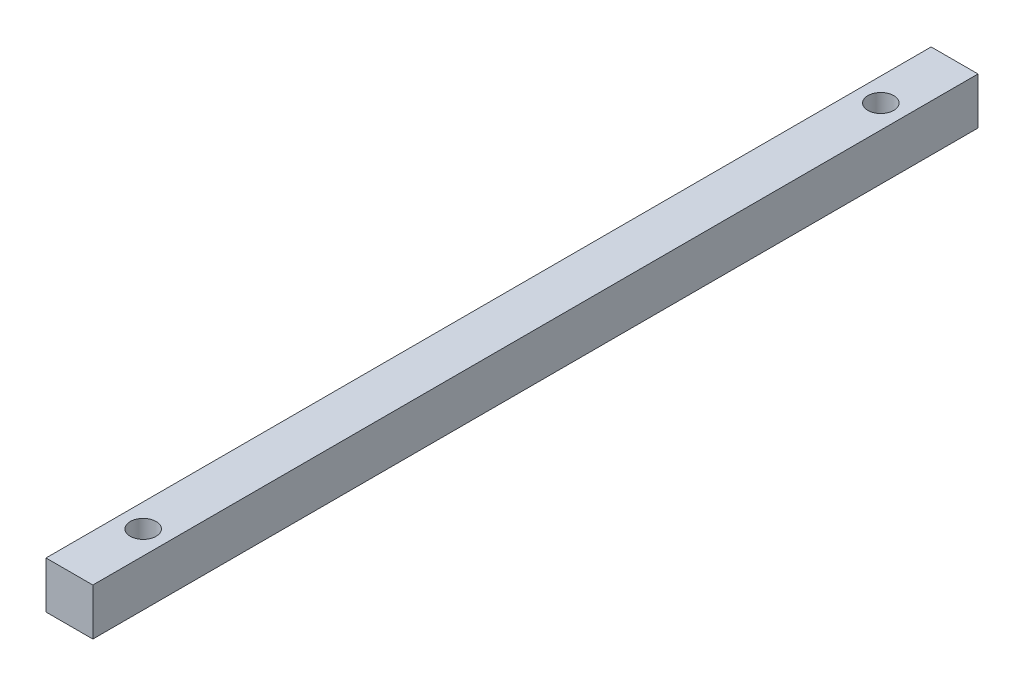
ISO-10303-21;
HEADER;
FILE_DESCRIPTION(('STEP AP214'),'2;1');
FILE_NAME('part.step','',(''),(''),'','','');
FILE_SCHEMA(('AUTOMOTIVE_DESIGN { 1 0 10303 214 1 1 1 1 }'));
ENDSEC;
DATA;
#1=APPLICATION_CONTEXT('core data for automotive mechanical design processes');
#2=APPLICATION_PROTOCOL_DEFINITION('international standard','automotive_design',2000,#1);
#3=PRODUCT_CONTEXT('',#1,'mechanical');
#4=PRODUCT('Part','Part','',(#3));
#5=PRODUCT_RELATED_PRODUCT_CATEGORY('part','',(#4));
#6=PRODUCT_DEFINITION_FORMATION('','',#4);
#7=PRODUCT_DEFINITION_CONTEXT('part definition',#1,'design');
#8=PRODUCT_DEFINITION('design','',#6,#7);
#9=PRODUCT_DEFINITION_SHAPE('','',#8);
#10=(LENGTH_UNIT() NAMED_UNIT(*) SI_UNIT(.MILLI.,.METRE.));
#11=(NAMED_UNIT(*) PLANE_ANGLE_UNIT() SI_UNIT($,.RADIAN.));
#12=(NAMED_UNIT(*) SI_UNIT($,.STERADIAN.) SOLID_ANGLE_UNIT());
#13=UNCERTAINTY_MEASURE_WITH_UNIT(LENGTH_MEASURE(1.E-05),#10,'distance_accuracy_value','');
#14=(GEOMETRIC_REPRESENTATION_CONTEXT(3) GLOBAL_UNCERTAINTY_ASSIGNED_CONTEXT((#13)) GLOBAL_UNIT_ASSIGNED_CONTEXT((#10,
#11,#12)) REPRESENTATION_CONTEXT('',''));
#15=CARTESIAN_POINT('',(0.,0.,0.));
#16=DIRECTION('',(0.,0.,1.));
#17=DIRECTION('',(1.,0.,0.));
#18=AXIS2_PLACEMENT_3D('',#15,#16,#17);
#19=CARTESIAN_POINT('',(3.175,-3.175,609.6));
#20=DIRECTION('',(-1.,0.,0.));
#21=DIRECTION('',(0.,0.,1.));
#22=AXIS2_PLACEMENT_3D('',#19,#20,#21);
#23=PLANE('',#22);
#24=DIRECTION('',(0.,0.,-1.));
#25=VECTOR('',#24,1.);
#26=CARTESIAN_POINT('',(3.175,3.175,609.6));
#27=LINE('',#26,#25);
#28=CARTESIAN_POINT('',(3.175,3.175,-489.6));
#29=VERTEX_POINT('',#28);
#30=CARTESIAN_POINT('',(3.175,3.175,-609.6));
#31=VERTEX_POINT('',#30);
#32=EDGE_CURVE('E47',#29,#31,#27,.T.);
#33=ORIENTED_EDGE('',*,*,#32,.F.);
#34=DIRECTION('',(0.,-1.,0.));
#35=VECTOR('',#34,1.);
#36=CARTESIAN_POINT('',(3.175,-3.175,-489.6));
#37=LINE('',#36,#35);
#38=CARTESIAN_POINT('',(3.175,-3.175,-489.6));
#39=VERTEX_POINT('',#38);
#40=EDGE_CURVE('E79',#29,#39,#37,.T.);
#41=ORIENTED_EDGE('',*,*,#40,.T.);
#42=DIRECTION('',(0.,0.,-1.));
#43=VECTOR('',#42,1.);
#44=CARTESIAN_POINT('',(3.175,-3.175,609.6));
#45=LINE('',#44,#43);
#46=CARTESIAN_POINT('',(3.175,-3.175,-609.6));
#47=VERTEX_POINT('',#46);
#48=EDGE_CURVE('E61',#39,#47,#45,.T.);
#49=ORIENTED_EDGE('',*,*,#48,.T.);
#50=DIRECTION('',(0.,1.,0.));
#51=VECTOR('',#50,1.);
#52=CARTESIAN_POINT('',(3.175,-3.175,-609.6));
#53=LINE('',#52,#51);
#54=EDGE_CURVE('E85',#47,#31,#53,.T.);
#55=ORIENTED_EDGE('',*,*,#54,.T.);
#56=EDGE_LOOP('',(#33,#41,#49,#55));
#57=FACE_BOUND('',#56,.T.);
#58=ADVANCED_FACE('F39',(#57),#23,.F.);
#59=CARTESIAN_POINT('',(-3.175,3.175,609.6));
#60=DIRECTION('',(0.,-1.,0.));
#61=DIRECTION('',(0.,0.,-1.));
#62=AXIS2_PLACEMENT_3D('',#59,#60,#61);
#63=PLANE('',#62);
#64=CARTESIAN_POINT('',(0.,3.175,-599.6));
#65=DIRECTION('',(0.,1.,0.));
#66=DIRECTION('',(0.,0.,1.));
#67=AXIS2_PLACEMENT_3D('',#64,#65,#66);
#68=CIRCLE('',#67,1.74999999999997);
#69=CARTESIAN_POINT('',(0.,3.175,-597.85));
#70=VERTEX_POINT('',#69);
#71=EDGE_CURVE('E129',#70,#70,#68,.T.);
#72=ORIENTED_EDGE('',*,*,#71,.F.);
#73=EDGE_LOOP('',(#72));
#74=FACE_BOUND('',#73,.T.);
#75=CARTESIAN_POINT('',(0.,3.175,-499.6));
#76=DIRECTION('',(0.,1.,0.));
#77=DIRECTION('',(0.,0.,1.));
#78=AXIS2_PLACEMENT_3D('',#75,#76,#77);
#79=CIRCLE('',#78,1.74999999999999);
#80=CARTESIAN_POINT('',(0.,3.175,-497.85));
#81=VERTEX_POINT('',#80);
#82=EDGE_CURVE('E132',#81,#81,#79,.T.);
#83=ORIENTED_EDGE('',*,*,#82,.F.);
#84=EDGE_LOOP('',(#83));
#85=FACE_BOUND('',#84,.T.);
#86=DIRECTION('',(0.,0.,-1.));
#87=VECTOR('',#86,1.);
#88=CARTESIAN_POINT('',(-3.175,3.175,609.6));
#89=LINE('',#88,#87);
#90=CARTESIAN_POINT('',(-3.175,3.175,-489.6));
#91=VERTEX_POINT('',#90);
#92=CARTESIAN_POINT('',(-3.175,3.175,-609.6));
#93=VERTEX_POINT('',#92);
#94=EDGE_CURVE('E97',#91,#93,#89,.T.);
#95=ORIENTED_EDGE('',*,*,#94,.F.);
#96=DIRECTION('',(1.,0.,0.));
#97=VECTOR('',#96,1.);
#98=CARTESIAN_POINT('',(-3.175,3.175,-489.6));
#99=LINE('',#98,#97);
#100=EDGE_CURVE('E86',#91,#29,#99,.T.);
#101=ORIENTED_EDGE('',*,*,#100,.T.);
#102=ORIENTED_EDGE('',*,*,#32,.T.);
#103=DIRECTION('',(-1.,0.,0.));
#104=VECTOR('',#103,1.);
#105=CARTESIAN_POINT('',(-3.175,3.175,-609.6));
#106=LINE('',#105,#104);
#107=EDGE_CURVE('E110',#31,#93,#106,.T.);
#108=ORIENTED_EDGE('',*,*,#107,.T.);
#109=EDGE_LOOP('',(#95,#101,#102,#108));
#110=FACE_BOUND('',#109,.T.);
#111=ADVANCED_FACE('F109',(#74,#85,#110),#63,.F.);
#112=CARTESIAN_POINT('',(-3.175,-3.175,609.6));
#113=DIRECTION('',(1.,0.,0.));
#114=DIRECTION('',(0.,1.,0.));
#115=AXIS2_PLACEMENT_3D('',#112,#113,#114);
#116=PLANE('',#115);
#117=DIRECTION('',(0.,0.,-1.));
#118=VECTOR('',#117,1.);
#119=CARTESIAN_POINT('',(-3.175,-3.175,609.6));
#120=LINE('',#119,#118);
#121=CARTESIAN_POINT('',(-3.175,-3.175,-489.6));
#122=VERTEX_POINT('',#121);
#123=CARTESIAN_POINT('',(-3.175,-3.175,-609.6));
#124=VERTEX_POINT('',#123);
#125=EDGE_CURVE('E93',#122,#124,#120,.T.);
#126=ORIENTED_EDGE('',*,*,#125,.F.);
#127=DIRECTION('',(0.,1.,0.));
#128=VECTOR('',#127,1.);
#129=CARTESIAN_POINT('',(-3.175,-3.175,-489.6));
#130=LINE('',#129,#128);
#131=EDGE_CURVE('E54',#122,#91,#130,.T.);
#132=ORIENTED_EDGE('',*,*,#131,.T.);
#133=ORIENTED_EDGE('',*,*,#94,.T.);
#134=DIRECTION('',(0.,-1.,0.));
#135=VECTOR('',#134,1.);
#136=CARTESIAN_POINT('',(-3.175,-3.175,-609.6));
#137=LINE('',#136,#135);
#138=EDGE_CURVE('E99',#93,#124,#137,.T.);
#139=ORIENTED_EDGE('',*,*,#138,.T.);
#140=EDGE_LOOP('',(#126,#132,#133,#139));
#141=FACE_BOUND('',#140,.T.);
#142=ADVANCED_FACE('F122',(#141),#116,.F.);
#143=CARTESIAN_POINT('',(-3.175,-3.175,609.6));
#144=DIRECTION('',(0.,1.,0.));
#145=DIRECTION('',(-1.,0.,0.));
#146=AXIS2_PLACEMENT_3D('',#143,#144,#145);
#147=PLANE('',#146);
#148=CARTESIAN_POINT('',(0.,-3.175,-599.6));
#149=DIRECTION('',(0.,1.,0.));
#150=DIRECTION('',(0.,0.,1.));
#151=AXIS2_PLACEMENT_3D('',#148,#149,#150);
#152=CIRCLE('',#151,1.74999999999997);
#153=CARTESIAN_POINT('',(0.,-3.175,-597.85));
#154=VERTEX_POINT('',#153);
#155=EDGE_CURVE('E124',#154,#154,#152,.T.);
#156=ORIENTED_EDGE('',*,*,#155,.T.);
#157=EDGE_LOOP('',(#156));
#158=FACE_BOUND('',#157,.T.);
#159=CARTESIAN_POINT('',(0.,-3.175,-499.6));
#160=DIRECTION('',(0.,1.,0.));
#161=DIRECTION('',(0.,0.,1.));
#162=AXIS2_PLACEMENT_3D('',#159,#160,#161);
#163=CIRCLE('',#162,1.74999999999999);
#164=CARTESIAN_POINT('',(0.,-3.175,-497.85));
#165=VERTEX_POINT('',#164);
#166=EDGE_CURVE('E136',#165,#165,#163,.T.);
#167=ORIENTED_EDGE('',*,*,#166,.T.);
#168=EDGE_LOOP('',(#167));
#169=FACE_BOUND('',#168,.T.);
#170=ORIENTED_EDGE('',*,*,#48,.F.);
#171=DIRECTION('',(-1.,0.,0.));
#172=VECTOR('',#171,1.);
#173=CARTESIAN_POINT('',(-3.175,-3.175,-489.6));
#174=LINE('',#173,#172);
#175=EDGE_CURVE('E11',#39,#122,#174,.T.);
#176=ORIENTED_EDGE('',*,*,#175,.T.);
#177=ORIENTED_EDGE('',*,*,#125,.T.);
#178=DIRECTION('',(1.,0.,0.));
#179=VECTOR('',#178,1.);
#180=CARTESIAN_POINT('',(-3.175,-3.175,-609.6));
#181=LINE('',#180,#179);
#182=EDGE_CURVE('E91',#124,#47,#181,.T.);
#183=ORIENTED_EDGE('',*,*,#182,.T.);
#184=EDGE_LOOP('',(#170,#176,#177,#183));
#185=FACE_BOUND('',#184,.T.);
#186=ADVANCED_FACE('F89',(#158,#169,#185),#147,.F.);
#187=CARTESIAN_POINT('',(0.,0.,-609.6));
#188=DIRECTION('',(0.,0.,-1.));
#189=DIRECTION('',(-1.,0.,0.));
#190=AXIS2_PLACEMENT_3D('',#187,#188,#189);
#191=PLANE('',#190);
#192=ORIENTED_EDGE('',*,*,#54,.F.);
#193=ORIENTED_EDGE('',*,*,#182,.F.);
#194=ORIENTED_EDGE('',*,*,#138,.F.);
#195=ORIENTED_EDGE('',*,*,#107,.F.);
#196=EDGE_LOOP('',(#192,#193,#194,#195));
#197=FACE_BOUND('',#196,.T.);
#198=ADVANCED_FACE('F113',(#197),#191,.T.);
#199=CARTESIAN_POINT('',(0.,0.,-489.6));
#200=DIRECTION('',(0.,0.,-1.));
#201=DIRECTION('',(-1.,0.,0.));
#202=AXIS2_PLACEMENT_3D('',#199,#200,#201);
#203=PLANE('',#202);
#204=ORIENTED_EDGE('',*,*,#100,.F.);
#205=ORIENTED_EDGE('',*,*,#131,.F.);
#206=ORIENTED_EDGE('',*,*,#175,.F.);
#207=ORIENTED_EDGE('',*,*,#40,.F.);
#208=EDGE_LOOP('',(#204,#205,#206,#207));
#209=FACE_BOUND('',#208,.T.);
#210=ADVANCED_FACE('F78',(#209),#203,.F.);
#211=CARTESIAN_POINT('',(0.,-3.175,-499.6));
#212=DIRECTION('',(0.,1.,0.));
#213=DIRECTION('',(0.,0.,1.));
#214=AXIS2_PLACEMENT_3D('',#211,#212,#213);
#215=CYLINDRICAL_SURFACE('',#214,1.74999999999999);
#216=ORIENTED_EDGE('',*,*,#166,.F.);
#217=EDGE_LOOP('',(#216));
#218=FACE_BOUND('',#217,.T.);
#219=ORIENTED_EDGE('',*,*,#82,.T.);
#220=EDGE_LOOP('',(#219));
#221=FACE_BOUND('',#220,.T.);
#222=ADVANCED_FACE('F150',(#218,#221),#215,.F.);
#223=CARTESIAN_POINT('',(0.,-3.175,-599.6));
#224=DIRECTION('',(0.,1.,0.));
#225=DIRECTION('',(0.,0.,1.));
#226=AXIS2_PLACEMENT_3D('',#223,#224,#225);
#227=CYLINDRICAL_SURFACE('',#226,1.74999999999997);
#228=ORIENTED_EDGE('',*,*,#155,.F.);
#229=EDGE_LOOP('',(#228));
#230=FACE_BOUND('',#229,.T.);
#231=ORIENTED_EDGE('',*,*,#71,.T.);
#232=EDGE_LOOP('',(#231));
#233=FACE_BOUND('',#232,.T.);
#234=ADVANCED_FACE('F144',(#230,#233),#227,.F.);
#235=CLOSED_SHELL('',(#58,#111,#142,#186,#198,#210,#222,#234));
#236=MANIFOLD_SOLID_BREP('B2',#235);
#237=ADVANCED_BREP_SHAPE_REPRESENTATION('',(#18,#236),#14);
#238=SHAPE_DEFINITION_REPRESENTATION(#9,#237);
ENDSEC;
END-ISO-10303-21;
